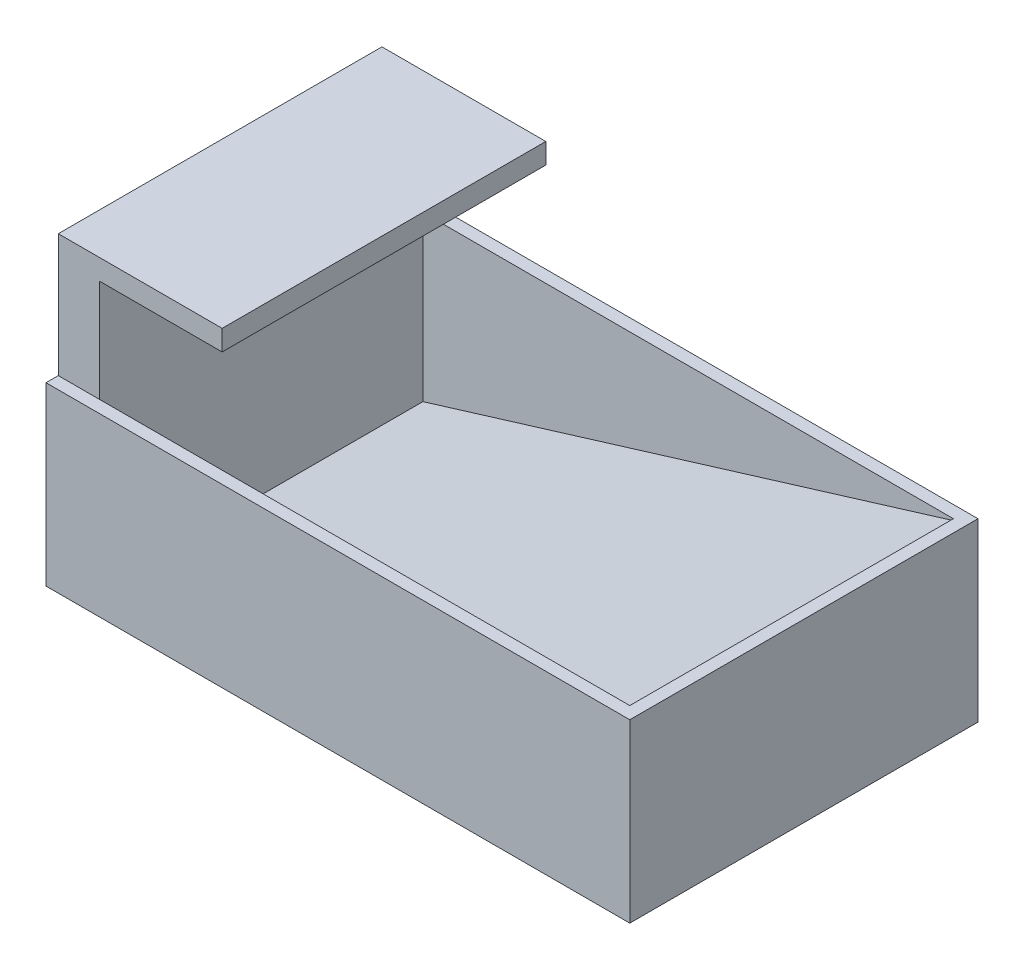
ISO-10303-21;
HEADER;
FILE_DESCRIPTION(('STEP AP214'),'2;1');
FILE_NAME('part.step','',(''),(''),'','','');
FILE_SCHEMA(('AUTOMOTIVE_DESIGN { 1 0 10303 214 1 1 1 1 }'));
ENDSEC;
DATA;
#1=APPLICATION_CONTEXT('core data for automotive mechanical design processes');
#2=APPLICATION_PROTOCOL_DEFINITION('international standard','automotive_design',2000,#1);
#3=PRODUCT_CONTEXT('',#1,'mechanical');
#4=PRODUCT('Part','Part','',(#3));
#5=PRODUCT_RELATED_PRODUCT_CATEGORY('part','',(#4));
#6=PRODUCT_DEFINITION_FORMATION('','',#4);
#7=PRODUCT_DEFINITION_CONTEXT('part definition',#1,'design');
#8=PRODUCT_DEFINITION('design','',#6,#7);
#9=PRODUCT_DEFINITION_SHAPE('','',#8);
#10=(LENGTH_UNIT() NAMED_UNIT(*) SI_UNIT(.MILLI.,.METRE.));
#11=(NAMED_UNIT(*) PLANE_ANGLE_UNIT() SI_UNIT($,.RADIAN.));
#12=(NAMED_UNIT(*) SI_UNIT($,.STERADIAN.) SOLID_ANGLE_UNIT());
#13=UNCERTAINTY_MEASURE_WITH_UNIT(LENGTH_MEASURE(1.E-05),#10,'distance_accuracy_value','');
#14=(GEOMETRIC_REPRESENTATION_CONTEXT(3) GLOBAL_UNCERTAINTY_ASSIGNED_CONTEXT((#13)) GLOBAL_UNIT_ASSIGNED_CONTEXT((#10,
#11,#12)) REPRESENTATION_CONTEXT('',''));
#15=CARTESIAN_POINT('',(0.,0.,0.));
#16=DIRECTION('',(0.,0.,1.));
#17=DIRECTION('',(1.,0.,0.));
#18=AXIS2_PLACEMENT_3D('',#15,#16,#17);
#19=CARTESIAN_POINT('',(0.,43.,0.));
#20=DIRECTION('',(0.,-1.,0.));
#21=DIRECTION('',(0.,0.,-1.));
#22=AXIS2_PLACEMENT_3D('',#19,#20,#21);
#23=PLANE('',#22);
#24=DIRECTION('',(1.,0.,0.));
#25=VECTOR('',#24,1.);
#26=CARTESIAN_POINT('',(0.,43.,-3.));
#27=LINE('',#26,#25);
#28=CARTESIAN_POINT('',(0.,43.,-3.));
#29=VERTEX_POINT('',#28);
#30=CARTESIAN_POINT('',(10.,43.,-3.));
#31=VERTEX_POINT('',#30);
#32=EDGE_CURVE('E285',#29,#31,#27,.T.);
#33=ORIENTED_EDGE('',*,*,#32,.F.);
#34=DIRECTION('',(0.,0.,1.));
#35=VECTOR('',#34,1.);
#36=CARTESIAN_POINT('',(0.,43.,0.));
#37=LINE('',#36,#35);
#38=CARTESIAN_POINT('',(0.,43.,0.));
#39=VERTEX_POINT('',#38);
#40=EDGE_CURVE('E189',#29,#39,#37,.T.);
#41=ORIENTED_EDGE('',*,*,#40,.T.);
#42=DIRECTION('',(1.,0.,0.));
#43=VECTOR('',#42,1.);
#44=CARTESIAN_POINT('',(0.,43.,0.));
#45=LINE('',#44,#43);
#46=CARTESIAN_POINT('',(142.5,43.,0.));
#47=VERTEX_POINT('',#46);
#48=EDGE_CURVE('E188',#39,#47,#45,.T.);
#49=ORIENTED_EDGE('',*,*,#48,.T.);
#50=DIRECTION('',(0.,0.,-1.));
#51=VECTOR('',#50,1.);
#52=CARTESIAN_POINT('',(142.5,43.,0.));
#53=LINE('',#52,#51);
#54=CARTESIAN_POINT('',(142.5,43.,-85.));
#55=VERTEX_POINT('',#54);
#56=EDGE_CURVE('E192',#47,#55,#53,.T.);
#57=ORIENTED_EDGE('',*,*,#56,.T.);
#58=DIRECTION('',(-1.,0.,0.));
#59=VECTOR('',#58,1.);
#60=CARTESIAN_POINT('',(0.,43.,-85.));
#61=LINE('',#60,#59);
#62=CARTESIAN_POINT('',(0.,43.,-85.));
#63=VERTEX_POINT('',#62);
#64=EDGE_CURVE('E195',#55,#63,#61,.T.);
#65=ORIENTED_EDGE('',*,*,#64,.T.);
#66=CARTESIAN_POINT('',(0.,43.,-82.));
#67=VERTEX_POINT('',#66);
#68=EDGE_CURVE('E184',#63,#67,#37,.T.);
#69=ORIENTED_EDGE('',*,*,#68,.T.);
#70=DIRECTION('',(1.,0.,0.));
#71=VECTOR('',#70,1.);
#72=CARTESIAN_POINT('',(0.,43.,-82.));
#73=LINE('',#72,#71);
#74=CARTESIAN_POINT('',(10.,43.,-82.));
#75=VERTEX_POINT('',#74);
#76=EDGE_CURVE('E245',#67,#75,#73,.T.);
#77=ORIENTED_EDGE('',*,*,#76,.T.);
#78=DIRECTION('',(-1.,0.,0.));
#79=VECTOR('',#78,1.);
#80=CARTESIAN_POINT('',(10.,43.,-82.));
#81=LINE('',#80,#79);
#82=CARTESIAN_POINT('',(139.5,43.,-82.));
#83=VERTEX_POINT('',#82);
#84=EDGE_CURVE('E158',#83,#75,#81,.T.);
#85=ORIENTED_EDGE('',*,*,#84,.F.);
#86=DIRECTION('',(0.,0.,-1.));
#87=VECTOR('',#86,1.);
#88=CARTESIAN_POINT('',(139.5,43.,-3.));
#89=LINE('',#88,#87);
#90=CARTESIAN_POINT('',(139.5,43.,-3.));
#91=VERTEX_POINT('',#90);
#92=EDGE_CURVE('E162',#91,#83,#89,.T.);
#93=ORIENTED_EDGE('',*,*,#92,.F.);
#94=DIRECTION('',(1.,0.,0.));
#95=VECTOR('',#94,1.);
#96=CARTESIAN_POINT('',(10.,43.,-3.));
#97=LINE('',#96,#95);
#98=EDGE_CURVE('E168',#31,#91,#97,.T.);
#99=ORIENTED_EDGE('',*,*,#98,.F.);
#100=EDGE_LOOP('',(#33,#41,#49,#57,#65,#69,#77,#85,#93,#99));
#101=FACE_BOUND('',#100,.T.);
#102=ADVANCED_FACE('F39',(#101),#23,.F.);
#103=CARTESIAN_POINT('',(0.,43.,0.));
#104=DIRECTION('',(1.,0.,0.));
#105=DIRECTION('',(0.,0.,-1.));
#106=AXIS2_PLACEMENT_3D('',#103,#104,#105);
#107=PLANE('',#106);
#108=DIRECTION('',(0.,0.,1.));
#109=VECTOR('',#108,1.);
#110=CARTESIAN_POINT('',(0.,0.,0.));
#111=LINE('',#110,#109);
#112=CARTESIAN_POINT('',(0.,0.,-85.));
#113=VERTEX_POINT('',#112);
#114=CARTESIAN_POINT('',(0.,0.,0.));
#115=VERTEX_POINT('',#114);
#116=EDGE_CURVE('E178',#113,#115,#111,.T.);
#117=ORIENTED_EDGE('',*,*,#116,.T.);
#118=DIRECTION('',(0.,-1.,0.));
#119=VECTOR('',#118,1.);
#120=CARTESIAN_POINT('',(0.,43.,0.));
#121=LINE('',#120,#119);
#122=EDGE_CURVE('E11',#39,#115,#121,.T.);
#123=ORIENTED_EDGE('',*,*,#122,.F.);
#124=ORIENTED_EDGE('',*,*,#40,.F.);
#125=DIRECTION('',(0.,-1.,0.));
#126=VECTOR('',#125,1.);
#127=CARTESIAN_POINT('',(0.,73.,-3.));
#128=LINE('',#127,#126);
#129=CARTESIAN_POINT('',(0.,73.,-3.));
#130=VERTEX_POINT('',#129);
#131=EDGE_CURVE('E249',#130,#29,#128,.T.);
#132=ORIENTED_EDGE('',*,*,#131,.F.);
#133=DIRECTION('',(0.,0.,1.));
#134=VECTOR('',#133,1.);
#135=CARTESIAN_POINT('',(0.,73.,-82.));
#136=LINE('',#135,#134);
#137=CARTESIAN_POINT('',(0.,73.,-82.));
#138=VERTEX_POINT('',#137);
#139=EDGE_CURVE('E171',#138,#130,#136,.T.);
#140=ORIENTED_EDGE('',*,*,#139,.F.);
#141=DIRECTION('',(0.,-1.,0.));
#142=VECTOR('',#141,1.);
#143=CARTESIAN_POINT('',(0.,73.,-82.));
#144=LINE('',#143,#142);
#145=EDGE_CURVE('E240',#138,#67,#144,.T.);
#146=ORIENTED_EDGE('',*,*,#145,.T.);
#147=ORIENTED_EDGE('',*,*,#68,.F.);
#148=DIRECTION('',(0.,-1.,0.));
#149=VECTOR('',#148,1.);
#150=CARTESIAN_POINT('',(0.,43.,-85.));
#151=LINE('',#150,#149);
#152=EDGE_CURVE('E198',#63,#113,#151,.T.);
#153=ORIENTED_EDGE('',*,*,#152,.T.);
#154=EDGE_LOOP('',(#117,#123,#124,#132,#140,#146,#147,#153));
#155=FACE_BOUND('',#154,.T.);
#156=ADVANCED_FACE('F41',(#155),#107,.F.);
#157=CARTESIAN_POINT('',(0.,43.,0.));
#158=DIRECTION('',(0.,0.,-1.));
#159=DIRECTION('',(-1.,0.,0.));
#160=AXIS2_PLACEMENT_3D('',#157,#158,#159);
#161=PLANE('',#160);
#162=DIRECTION('',(1.,0.,0.));
#163=VECTOR('',#162,1.);
#164=CARTESIAN_POINT('',(0.,0.,0.));
#165=LINE('',#164,#163);
#166=CARTESIAN_POINT('',(142.5,0.,0.));
#167=VERTEX_POINT('',#166);
#168=EDGE_CURVE('E202',#115,#167,#165,.T.);
#169=ORIENTED_EDGE('',*,*,#168,.T.);
#170=DIRECTION('',(0.,-1.,0.));
#171=VECTOR('',#170,1.);
#172=CARTESIAN_POINT('',(142.5,43.,0.));
#173=LINE('',#172,#171);
#174=EDGE_CURVE('E48',#47,#167,#173,.T.);
#175=ORIENTED_EDGE('',*,*,#174,.F.);
#176=ORIENTED_EDGE('',*,*,#48,.F.);
#177=ORIENTED_EDGE('',*,*,#122,.T.);
#178=EDGE_LOOP('',(#169,#175,#176,#177));
#179=FACE_BOUND('',#178,.T.);
#180=ADVANCED_FACE('F247',(#179),#161,.F.);
#181=CARTESIAN_POINT('',(142.5,43.,0.));
#182=DIRECTION('',(-1.,0.,0.));
#183=DIRECTION('',(0.,0.,1.));
#184=AXIS2_PLACEMENT_3D('',#181,#182,#183);
#185=PLANE('',#184);
#186=DIRECTION('',(0.,0.,-1.));
#187=VECTOR('',#186,1.);
#188=CARTESIAN_POINT('',(142.5,0.,0.));
#189=LINE('',#188,#187);
#190=CARTESIAN_POINT('',(142.5,0.,-85.));
#191=VERTEX_POINT('',#190);
#192=EDGE_CURVE('E205',#167,#191,#189,.T.);
#193=ORIENTED_EDGE('',*,*,#192,.T.);
#194=DIRECTION('',(0.,-1.,0.));
#195=VECTOR('',#194,1.);
#196=CARTESIAN_POINT('',(142.5,43.,-85.));
#197=LINE('',#196,#195);
#198=EDGE_CURVE('E214',#55,#191,#197,.T.);
#199=ORIENTED_EDGE('',*,*,#198,.F.);
#200=ORIENTED_EDGE('',*,*,#56,.F.);
#201=ORIENTED_EDGE('',*,*,#174,.T.);
#202=EDGE_LOOP('',(#193,#199,#200,#201));
#203=FACE_BOUND('',#202,.T.);
#204=ADVANCED_FACE('F223',(#203),#185,.F.);
#205=CARTESIAN_POINT('',(0.,43.,-85.));
#206=DIRECTION('',(0.,0.,1.));
#207=DIRECTION('',(1.,0.,0.));
#208=AXIS2_PLACEMENT_3D('',#205,#206,#207);
#209=PLANE('',#208);
#210=DIRECTION('',(-1.,0.,0.));
#211=VECTOR('',#210,1.);
#212=CARTESIAN_POINT('',(0.,0.,-85.));
#213=LINE('',#212,#211);
#214=EDGE_CURVE('E208',#191,#113,#213,.T.);
#215=ORIENTED_EDGE('',*,*,#214,.T.);
#216=ORIENTED_EDGE('',*,*,#152,.F.);
#217=ORIENTED_EDGE('',*,*,#64,.F.);
#218=ORIENTED_EDGE('',*,*,#198,.T.);
#219=EDGE_LOOP('',(#215,#216,#217,#218));
#220=FACE_BOUND('',#219,.T.);
#221=ADVANCED_FACE('F233',(#220),#209,.F.);
#222=CARTESIAN_POINT('',(0.,0.,0.));
#223=DIRECTION('',(0.,-1.,0.));
#224=DIRECTION('',(0.,0.,-1.));
#225=AXIS2_PLACEMENT_3D('',#222,#223,#224);
#226=PLANE('',#225);
#227=ORIENTED_EDGE('',*,*,#116,.F.);
#228=ORIENTED_EDGE('',*,*,#214,.F.);
#229=ORIENTED_EDGE('',*,*,#192,.F.);
#230=ORIENTED_EDGE('',*,*,#168,.F.);
#231=EDGE_LOOP('',(#227,#228,#229,#230));
#232=FACE_BOUND('',#231,.T.);
#233=ADVANCED_FACE('F230',(#232),#226,.T.);
#234=CARTESIAN_POINT('',(10.,3.,-3.));
#235=DIRECTION('',(-1.,0.,0.));
#236=DIRECTION('',(0.,0.,1.));
#237=AXIS2_PLACEMENT_3D('',#234,#235,#236);
#238=PLANE('',#237);
#239=DIRECTION('',(0.,1.,0.));
#240=VECTOR('',#239,1.);
#241=CARTESIAN_POINT('',(10.,3.,-82.));
#242=LINE('',#241,#240);
#243=CARTESIAN_POINT('',(10.,3.,-82.));
#244=VERTEX_POINT('',#243);
#245=EDGE_CURVE('E175',#244,#75,#242,.T.);
#246=ORIENTED_EDGE('',*,*,#245,.T.);
#247=DIRECTION('',(0.,1.,0.));
#248=VECTOR('',#247,1.);
#249=CARTESIAN_POINT('',(10.,43.,-82.));
#250=LINE('',#249,#248);
#251=CARTESIAN_POINT('',(10.,68.,-82.));
#252=VERTEX_POINT('',#251);
#253=EDGE_CURVE('E259',#75,#252,#250,.T.);
#254=ORIENTED_EDGE('',*,*,#253,.T.);
#255=DIRECTION('',(0.,0.,1.));
#256=VECTOR('',#255,1.);
#257=CARTESIAN_POINT('',(10.,68.,-82.));
#258=LINE('',#257,#256);
#259=CARTESIAN_POINT('',(10.,68.,-3.));
#260=VERTEX_POINT('',#259);
#261=EDGE_CURVE('E166',#252,#260,#258,.T.);
#262=ORIENTED_EDGE('',*,*,#261,.T.);
#263=DIRECTION('',(0.,1.,0.));
#264=VECTOR('',#263,1.);
#265=CARTESIAN_POINT('',(10.,43.,-3.));
#266=LINE('',#265,#264);
#267=EDGE_CURVE('E142',#31,#260,#266,.T.);
#268=ORIENTED_EDGE('',*,*,#267,.F.);
#269=DIRECTION('',(0.,1.,0.));
#270=VECTOR('',#269,1.);
#271=CARTESIAN_POINT('',(10.,3.,-3.));
#272=LINE('',#271,#270);
#273=CARTESIAN_POINT('',(10.,3.,-3.));
#274=VERTEX_POINT('',#273);
#275=EDGE_CURVE('E135',#274,#31,#272,.T.);
#276=ORIENTED_EDGE('',*,*,#275,.F.);
#277=DIRECTION('',(0.,0.,1.));
#278=VECTOR('',#277,1.);
#279=CARTESIAN_POINT('',(10.,3.,-3.));
#280=LINE('',#279,#278);
#281=EDGE_CURVE('E140',#244,#274,#280,.T.);
#282=ORIENTED_EDGE('',*,*,#281,.F.);
#283=EDGE_LOOP('',(#246,#254,#262,#268,#276,#282));
#284=FACE_BOUND('',#283,.T.);
#285=ADVANCED_FACE('F138',(#284),#238,.F.);
#286=CARTESIAN_POINT('',(10.,3.,-82.));
#287=DIRECTION('',(0.,0.,-1.));
#288=DIRECTION('',(-1.,0.,0.));
#289=AXIS2_PLACEMENT_3D('',#286,#287,#288);
#290=PLANE('',#289);
#291=ORIENTED_EDGE('',*,*,#245,.F.);
#292=DIRECTION('',(-0.956304755963037,-0.292371704722731,0.));
#293=VECTOR('',#292,1.);
#294=CARTESIAN_POINT('',(10.,3.,-82.));
#295=LINE('',#294,#293);
#296=CARTESIAN_POINT('',(139.5,42.5921232488956,-82.));
#297=VERTEX_POINT('',#296);
#298=EDGE_CURVE('E55',#297,#244,#295,.T.);
#299=ORIENTED_EDGE('',*,*,#298,.F.);
#300=DIRECTION('',(0.,1.,0.));
#301=VECTOR('',#300,1.);
#302=CARTESIAN_POINT('',(139.5,3.,-82.));
#303=LINE('',#302,#301);
#304=EDGE_CURVE('E179',#297,#83,#303,.T.);
#305=ORIENTED_EDGE('',*,*,#304,.T.);
#306=ORIENTED_EDGE('',*,*,#84,.T.);
#307=EDGE_LOOP('',(#291,#299,#305,#306));
#308=FACE_BOUND('',#307,.T.);
#309=ADVANCED_FACE('F320',(#308),#290,.F.);
#310=CARTESIAN_POINT('',(139.5,3.,-3.));
#311=DIRECTION('',(1.,0.,0.));
#312=DIRECTION('',(0.,0.,-1.));
#313=AXIS2_PLACEMENT_3D('',#310,#311,#312);
#314=PLANE('',#313);
#315=ORIENTED_EDGE('',*,*,#304,.F.);
#316=DIRECTION('',(0.,0.,1.));
#317=VECTOR('',#316,1.);
#318=CARTESIAN_POINT('',(139.5,42.5921232488956,-82.));
#319=LINE('',#318,#317);
#320=CARTESIAN_POINT('',(139.5,42.5921232488956,-3.));
#321=VERTEX_POINT('',#320);
#322=EDGE_CURVE('E62',#297,#321,#319,.T.);
#323=ORIENTED_EDGE('',*,*,#322,.T.);
#324=DIRECTION('',(0.,1.,0.));
#325=VECTOR('',#324,1.);
#326=CARTESIAN_POINT('',(139.5,3.,-3.));
#327=LINE('',#326,#325);
#328=EDGE_CURVE('E148',#321,#91,#327,.T.);
#329=ORIENTED_EDGE('',*,*,#328,.T.);
#330=ORIENTED_EDGE('',*,*,#92,.T.);
#331=EDGE_LOOP('',(#315,#323,#329,#330));
#332=FACE_BOUND('',#331,.T.);
#333=ADVANCED_FACE('F319',(#332),#314,.F.);
#334=CARTESIAN_POINT('',(10.,3.,-3.));
#335=DIRECTION('',(0.,0.,1.));
#336=DIRECTION('',(1.,0.,0.));
#337=AXIS2_PLACEMENT_3D('',#334,#335,#336);
#338=PLANE('',#337);
#339=ORIENTED_EDGE('',*,*,#328,.F.);
#340=DIRECTION('',(-0.956304755963037,-0.292371704722731,0.));
#341=VECTOR('',#340,1.);
#342=CARTESIAN_POINT('',(10.,3.,-3.));
#343=LINE('',#342,#341);
#344=EDGE_CURVE('E151',#321,#274,#343,.T.);
#345=ORIENTED_EDGE('',*,*,#344,.T.);
#346=ORIENTED_EDGE('',*,*,#275,.T.);
#347=ORIENTED_EDGE('',*,*,#98,.T.);
#348=EDGE_LOOP('',(#339,#345,#346,#347));
#349=FACE_BOUND('',#348,.T.);
#350=ADVANCED_FACE('F152',(#349),#338,.F.);
#351=CARTESIAN_POINT('',(40.,73.,-82.));
#352=DIRECTION('',(0.,1.,0.));
#353=DIRECTION('',(0.,0.,1.));
#354=AXIS2_PLACEMENT_3D('',#351,#352,#353);
#355=PLANE('',#354);
#356=DIRECTION('',(-1.,0.,0.));
#357=VECTOR('',#356,1.);
#358=CARTESIAN_POINT('',(40.,73.,-3.));
#359=LINE('',#358,#357);
#360=CARTESIAN_POINT('',(40.,73.,-3.));
#361=VERTEX_POINT('',#360);
#362=EDGE_CURVE('E255',#361,#130,#359,.T.);
#363=ORIENTED_EDGE('',*,*,#362,.F.);
#364=DIRECTION('',(0.,0.,1.));
#365=VECTOR('',#364,1.);
#366=CARTESIAN_POINT('',(40.,73.,-82.));
#367=LINE('',#366,#365);
#368=CARTESIAN_POINT('',(40.,73.,-82.));
#369=VERTEX_POINT('',#368);
#370=EDGE_CURVE('E267',#369,#361,#367,.T.);
#371=ORIENTED_EDGE('',*,*,#370,.F.);
#372=DIRECTION('',(-1.,0.,0.));
#373=VECTOR('',#372,1.);
#374=CARTESIAN_POINT('',(40.,73.,-82.));
#375=LINE('',#374,#373);
#376=EDGE_CURVE('E278',#369,#138,#375,.T.);
#377=ORIENTED_EDGE('',*,*,#376,.T.);
#378=ORIENTED_EDGE('',*,*,#139,.T.);
#379=EDGE_LOOP('',(#363,#371,#377,#378));
#380=FACE_BOUND('',#379,.T.);
#381=ADVANCED_FACE('F303',(#380),#355,.T.);
#382=CARTESIAN_POINT('',(40.,68.,-82.));
#383=DIRECTION('',(1.,0.,0.));
#384=DIRECTION('',(0.,0.,-1.));
#385=AXIS2_PLACEMENT_3D('',#382,#383,#384);
#386=PLANE('',#385);
#387=DIRECTION('',(0.,1.,0.));
#388=VECTOR('',#387,1.);
#389=CARTESIAN_POINT('',(40.,68.,-3.));
#390=LINE('',#389,#388);
#391=CARTESIAN_POINT('',(40.,68.,-3.));
#392=VERTEX_POINT('',#391);
#393=EDGE_CURVE('E261',#392,#361,#390,.T.);
#394=ORIENTED_EDGE('',*,*,#393,.F.);
#395=DIRECTION('',(0.,0.,1.));
#396=VECTOR('',#395,1.);
#397=CARTESIAN_POINT('',(40.,68.,-82.));
#398=LINE('',#397,#396);
#399=CARTESIAN_POINT('',(40.,68.,-82.));
#400=VERTEX_POINT('',#399);
#401=EDGE_CURVE('E269',#400,#392,#398,.T.);
#402=ORIENTED_EDGE('',*,*,#401,.F.);
#403=DIRECTION('',(0.,1.,0.));
#404=VECTOR('',#403,1.);
#405=CARTESIAN_POINT('',(40.,68.,-82.));
#406=LINE('',#405,#404);
#407=EDGE_CURVE('E281',#400,#369,#406,.T.);
#408=ORIENTED_EDGE('',*,*,#407,.T.);
#409=ORIENTED_EDGE('',*,*,#370,.T.);
#410=EDGE_LOOP('',(#394,#402,#408,#409));
#411=FACE_BOUND('',#410,.T.);
#412=ADVANCED_FACE('F298',(#411),#386,.T.);
#413=CARTESIAN_POINT('',(10.,68.,-82.));
#414=DIRECTION('',(0.,-1.,0.));
#415=DIRECTION('',(0.,0.,-1.));
#416=AXIS2_PLACEMENT_3D('',#413,#414,#415);
#417=PLANE('',#416);
#418=DIRECTION('',(1.,0.,0.));
#419=VECTOR('',#418,1.);
#420=CARTESIAN_POINT('',(10.,68.,-3.));
#421=LINE('',#420,#419);
#422=EDGE_CURVE('E290',#260,#392,#421,.T.);
#423=ORIENTED_EDGE('',*,*,#422,.F.);
#424=ORIENTED_EDGE('',*,*,#261,.F.);
#425=DIRECTION('',(1.,0.,0.));
#426=VECTOR('',#425,1.);
#427=CARTESIAN_POINT('',(10.,68.,-82.));
#428=LINE('',#427,#426);
#429=EDGE_CURVE('E307',#252,#400,#428,.T.);
#430=ORIENTED_EDGE('',*,*,#429,.T.);
#431=ORIENTED_EDGE('',*,*,#401,.T.);
#432=EDGE_LOOP('',(#423,#424,#430,#431));
#433=FACE_BOUND('',#432,.T.);
#434=ADVANCED_FACE('F317',(#433),#417,.T.);
#435=CARTESIAN_POINT('',(0.,0.,-82.));
#436=DIRECTION('',(0.,0.,1.));
#437=DIRECTION('',(1.,0.,0.));
#438=AXIS2_PLACEMENT_3D('',#435,#436,#437);
#439=PLANE('',#438);
#440=ORIENTED_EDGE('',*,*,#76,.F.);
#441=ORIENTED_EDGE('',*,*,#145,.F.);
#442=ORIENTED_EDGE('',*,*,#376,.F.);
#443=ORIENTED_EDGE('',*,*,#407,.F.);
#444=ORIENTED_EDGE('',*,*,#429,.F.);
#445=ORIENTED_EDGE('',*,*,#253,.F.);
#446=EDGE_LOOP('',(#440,#441,#442,#443,#444,#445));
#447=FACE_BOUND('',#446,.T.);
#448=ADVANCED_FACE('F305',(#447),#439,.F.);
#449=CARTESIAN_POINT('',(0.,0.,-3.));
#450=DIRECTION('',(0.,0.,1.));
#451=DIRECTION('',(1.,0.,0.));
#452=AXIS2_PLACEMENT_3D('',#449,#450,#451);
#453=PLANE('',#452);
#454=ORIENTED_EDGE('',*,*,#32,.T.);
#455=ORIENTED_EDGE('',*,*,#267,.T.);
#456=ORIENTED_EDGE('',*,*,#422,.T.);
#457=ORIENTED_EDGE('',*,*,#393,.T.);
#458=ORIENTED_EDGE('',*,*,#362,.T.);
#459=ORIENTED_EDGE('',*,*,#131,.T.);
#460=EDGE_LOOP('',(#454,#455,#456,#457,#458,#459));
#461=FACE_BOUND('',#460,.T.);
#462=ADVANCED_FACE('F295',(#461),#453,.T.);
#463=CARTESIAN_POINT('',(10.,3.,-82.));
#464=DIRECTION('',(-0.292371704722731,0.956304755963037,0.));
#465=DIRECTION('',(-0.956304755963037,-0.292371704722731,0.));
#466=AXIS2_PLACEMENT_3D('',#463,#464,#465);
#467=PLANE('',#466);
#468=ORIENTED_EDGE('',*,*,#344,.F.);
#469=ORIENTED_EDGE('',*,*,#322,.F.);
#470=ORIENTED_EDGE('',*,*,#298,.T.);
#471=ORIENTED_EDGE('',*,*,#281,.T.);
#472=EDGE_LOOP('',(#468,#469,#470,#471));
#473=FACE_BOUND('',#472,.T.);
#474=ADVANCED_FACE('F156',(#473),#467,.T.);
#475=CLOSED_SHELL('',(#102,#156,#180,#204,#221,#233,#285,#309,#333,#350,#381,#412,#434,#448,
#462,#474));
#476=MANIFOLD_SOLID_BREP('B2',#475);
#477=ADVANCED_BREP_SHAPE_REPRESENTATION('',(#18,#476),#14);
#478=SHAPE_DEFINITION_REPRESENTATION(#9,#477);
ENDSEC;
END-ISO-10303-21;
